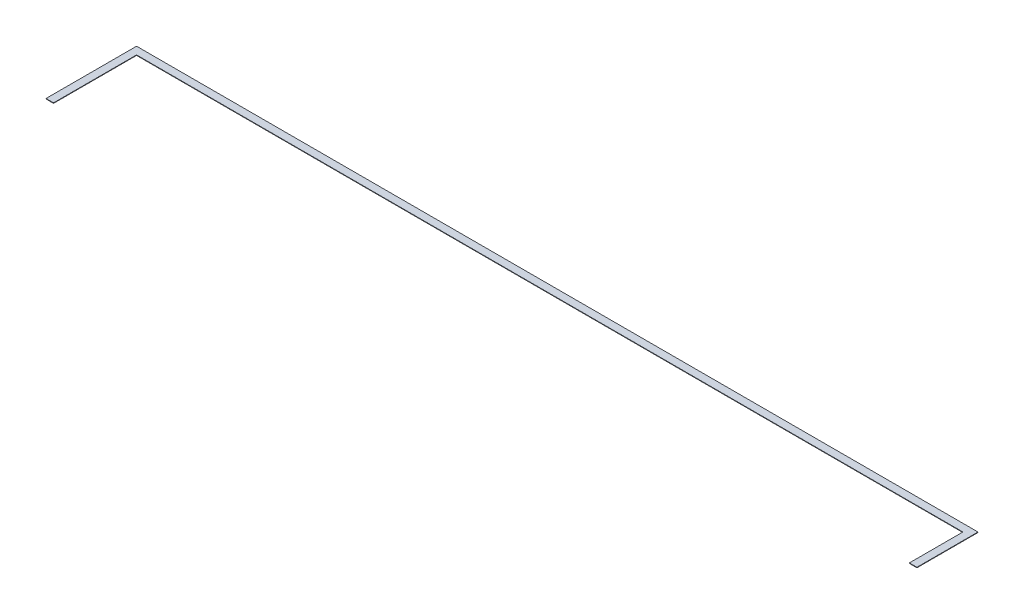
ISO-10303-21;
HEADER;
FILE_DESCRIPTION(('STEP AP214'),'2;1');
FILE_NAME('part.step','',(''),(''),'','','');
FILE_SCHEMA(('AUTOMOTIVE_DESIGN { 1 0 10303 214 1 1 1 1 }'));
ENDSEC;
DATA;
#1=APPLICATION_CONTEXT('core data for automotive mechanical design processes');
#2=APPLICATION_PROTOCOL_DEFINITION('international standard','automotive_design',2000,#1);
#3=PRODUCT_CONTEXT('',#1,'mechanical');
#4=PRODUCT('Part','Part','',(#3));
#5=PRODUCT_RELATED_PRODUCT_CATEGORY('part','',(#4));
#6=PRODUCT_DEFINITION_FORMATION('','',#4);
#7=PRODUCT_DEFINITION_CONTEXT('part definition',#1,'design');
#8=PRODUCT_DEFINITION('design','',#6,#7);
#9=PRODUCT_DEFINITION_SHAPE('','',#8);
#10=(LENGTH_UNIT() NAMED_UNIT(*) SI_UNIT(.MILLI.,.METRE.));
#11=(NAMED_UNIT(*) PLANE_ANGLE_UNIT() SI_UNIT($,.RADIAN.));
#12=(NAMED_UNIT(*) SI_UNIT($,.STERADIAN.) SOLID_ANGLE_UNIT());
#13=UNCERTAINTY_MEASURE_WITH_UNIT(LENGTH_MEASURE(1.E-05),#10,'distance_accuracy_value','');
#14=(GEOMETRIC_REPRESENTATION_CONTEXT(3) GLOBAL_UNCERTAINTY_ASSIGNED_CONTEXT((#13)) GLOBAL_UNIT_ASSIGNED_CONTEXT((#10,
#11,#12)) REPRESENTATION_CONTEXT('',''));
#15=CARTESIAN_POINT('',(0.,0.,0.));
#16=DIRECTION('',(0.,0.,1.));
#17=DIRECTION('',(1.,0.,0.));
#18=AXIS2_PLACEMENT_3D('',#15,#16,#17);
#19=CARTESIAN_POINT('',(0.,3.175,0.));
#20=DIRECTION('',(1.,0.,0.));
#21=DIRECTION('',(0.,0.,-1.));
#22=AXIS2_PLACEMENT_3D('',#19,#20,#21);
#23=PLANE('',#22);
#24=DIRECTION('',(0.,0.,1.));
#25=VECTOR('',#24,1.);
#26=CARTESIAN_POINT('',(0.,0.,0.));
#27=LINE('',#26,#25);
#28=CARTESIAN_POINT('',(0.,0.,-609.6));
#29=VERTEX_POINT('',#28);
#30=CARTESIAN_POINT('',(0.,0.,0.));
#31=VERTEX_POINT('',#30);
#32=EDGE_CURVE('E129',#29,#31,#27,.T.);
#33=ORIENTED_EDGE('',*,*,#32,.T.);
#34=DIRECTION('',(0.,-1.,0.));
#35=VECTOR('',#34,1.);
#36=CARTESIAN_POINT('',(0.,3.175,0.));
#37=LINE('',#36,#35);
#38=CARTESIAN_POINT('',(0.,3.175,0.));
#39=VERTEX_POINT('',#38);
#40=EDGE_CURVE('E11',#39,#31,#37,.T.);
#41=ORIENTED_EDGE('',*,*,#40,.F.);
#42=DIRECTION('',(0.,0.,1.));
#43=VECTOR('',#42,1.);
#44=CARTESIAN_POINT('',(0.,3.175,0.));
#45=LINE('',#44,#43);
#46=CARTESIAN_POINT('',(0.,3.175,-609.6));
#47=VERTEX_POINT('',#46);
#48=EDGE_CURVE('E143',#47,#39,#45,.T.);
#49=ORIENTED_EDGE('',*,*,#48,.F.);
#50=DIRECTION('',(0.,-1.,0.));
#51=VECTOR('',#50,1.);
#52=CARTESIAN_POINT('',(0.,3.175,-609.6));
#53=LINE('',#52,#51);
#54=EDGE_CURVE('E125',#47,#29,#53,.T.);
#55=ORIENTED_EDGE('',*,*,#54,.T.);
#56=EDGE_LOOP('',(#33,#41,#49,#55));
#57=FACE_BOUND('',#56,.T.);
#58=ADVANCED_FACE('F33',(#57),#23,.F.);
#59=CARTESIAN_POINT('',(0.,3.175,0.));
#60=DIRECTION('',(0.,0.,-1.));
#61=DIRECTION('',(-1.,0.,0.));
#62=AXIS2_PLACEMENT_3D('',#59,#60,#61);
#63=PLANE('',#62);
#64=DIRECTION('',(1.,0.,0.));
#65=VECTOR('',#64,1.);
#66=CARTESIAN_POINT('',(0.,0.,0.));
#67=LINE('',#66,#65);
#68=CARTESIAN_POINT('',(50.8,0.,0.));
#69=VERTEX_POINT('',#68);
#70=EDGE_CURVE('E132',#31,#69,#67,.T.);
#71=ORIENTED_EDGE('',*,*,#70,.T.);
#72=DIRECTION('',(0.,-1.,0.));
#73=VECTOR('',#72,1.);
#74=CARTESIAN_POINT('',(50.8,3.175,0.));
#75=LINE('',#74,#73);
#76=CARTESIAN_POINT('',(50.8,3.175,0.));
#77=VERTEX_POINT('',#76);
#78=EDGE_CURVE('E41',#77,#69,#75,.T.);
#79=ORIENTED_EDGE('',*,*,#78,.F.);
#80=DIRECTION('',(1.,0.,0.));
#81=VECTOR('',#80,1.);
#82=CARTESIAN_POINT('',(0.,3.175,0.));
#83=LINE('',#82,#81);
#84=EDGE_CURVE('E92',#39,#77,#83,.T.);
#85=ORIENTED_EDGE('',*,*,#84,.F.);
#86=ORIENTED_EDGE('',*,*,#40,.T.);
#87=EDGE_LOOP('',(#71,#79,#85,#86));
#88=FACE_BOUND('',#87,.T.);
#89=ADVANCED_FACE('F178',(#88),#63,.F.);
#90=CARTESIAN_POINT('',(50.8,3.175,0.));
#91=DIRECTION('',(-1.,0.,0.));
#92=DIRECTION('',(0.,0.,1.));
#93=AXIS2_PLACEMENT_3D('',#90,#91,#92);
#94=PLANE('',#93);
#95=DIRECTION('',(0.,0.,-1.));
#96=VECTOR('',#95,1.);
#97=CARTESIAN_POINT('',(50.8,0.,0.));
#98=LINE('',#97,#96);
#99=CARTESIAN_POINT('',(50.8,0.,-558.8));
#100=VERTEX_POINT('',#99);
#101=EDGE_CURVE('E134',#69,#100,#98,.T.);
#102=ORIENTED_EDGE('',*,*,#101,.T.);
#103=DIRECTION('',(0.,-1.,0.));
#104=VECTOR('',#103,1.);
#105=CARTESIAN_POINT('',(50.8,3.175,-558.8));
#106=LINE('',#105,#104);
#107=CARTESIAN_POINT('',(50.8,3.175,-558.8));
#108=VERTEX_POINT('',#107);
#109=EDGE_CURVE('E150',#108,#100,#106,.T.);
#110=ORIENTED_EDGE('',*,*,#109,.F.);
#111=DIRECTION('',(0.,0.,-1.));
#112=VECTOR('',#111,1.);
#113=CARTESIAN_POINT('',(50.8,3.175,0.));
#114=LINE('',#113,#112);
#115=EDGE_CURVE('E158',#77,#108,#114,.T.);
#116=ORIENTED_EDGE('',*,*,#115,.F.);
#117=ORIENTED_EDGE('',*,*,#78,.T.);
#118=EDGE_LOOP('',(#102,#110,#116,#117));
#119=FACE_BOUND('',#118,.T.);
#120=ADVANCED_FACE('F156',(#119),#94,.F.);
#121=CARTESIAN_POINT('',(5613.4,3.175,-558.800000000001));
#122=DIRECTION('',(0.,0.,-1.));
#123=DIRECTION('',(-1.,0.,0.));
#124=AXIS2_PLACEMENT_3D('',#121,#122,#123);
#125=PLANE('',#124);
#126=DIRECTION('',(1.,0.,0.));
#127=VECTOR('',#126,1.);
#128=CARTESIAN_POINT('',(5613.4,0.,-558.800000000001));
#129=LINE('',#128,#127);
#130=CARTESIAN_POINT('',(5613.4,0.,-558.800000000001));
#131=VERTEX_POINT('',#130);
#132=EDGE_CURVE('E136',#100,#131,#129,.T.);
#133=ORIENTED_EDGE('',*,*,#132,.T.);
#134=DIRECTION('',(0.,-1.,0.));
#135=VECTOR('',#134,1.);
#136=CARTESIAN_POINT('',(5613.4,3.175,-558.800000000001));
#137=LINE('',#136,#135);
#138=CARTESIAN_POINT('',(5613.4,3.175,-558.800000000001));
#139=VERTEX_POINT('',#138);
#140=EDGE_CURVE('E147',#139,#131,#137,.T.);
#141=ORIENTED_EDGE('',*,*,#140,.F.);
#142=DIRECTION('',(1.,0.,0.));
#143=VECTOR('',#142,1.);
#144=CARTESIAN_POINT('',(5613.4,3.175,-558.800000000001));
#145=LINE('',#144,#143);
#146=EDGE_CURVE('E170',#108,#139,#145,.T.);
#147=ORIENTED_EDGE('',*,*,#146,.F.);
#148=ORIENTED_EDGE('',*,*,#109,.T.);
#149=EDGE_LOOP('',(#133,#141,#147,#148));
#150=FACE_BOUND('',#149,.T.);
#151=ADVANCED_FACE('F166',(#150),#125,.F.);
#152=CARTESIAN_POINT('',(5613.4,3.175,-198.4375));
#153=DIRECTION('',(1.,0.,0.));
#154=DIRECTION('',(0.,0.,-1.));
#155=AXIS2_PLACEMENT_3D('',#152,#153,#154);
#156=PLANE('',#155);
#157=DIRECTION('',(0.,0.,1.));
#158=VECTOR('',#157,1.);
#159=CARTESIAN_POINT('',(5613.4,0.,-198.4375));
#160=LINE('',#159,#158);
#161=CARTESIAN_POINT('',(5613.4,0.,-198.4375));
#162=VERTEX_POINT('',#161);
#163=EDGE_CURVE('E138',#131,#162,#160,.T.);
#164=ORIENTED_EDGE('',*,*,#163,.T.);
#165=DIRECTION('',(0.,-1.,0.));
#166=VECTOR('',#165,1.);
#167=CARTESIAN_POINT('',(5613.4,3.175,-198.4375));
#168=LINE('',#167,#166);
#169=CARTESIAN_POINT('',(5613.4,3.175,-198.4375));
#170=VERTEX_POINT('',#169);
#171=EDGE_CURVE('E120',#170,#162,#168,.T.);
#172=ORIENTED_EDGE('',*,*,#171,.F.);
#173=DIRECTION('',(0.,0.,1.));
#174=VECTOR('',#173,1.);
#175=CARTESIAN_POINT('',(5613.4,3.175,-198.4375));
#176=LINE('',#175,#174);
#177=EDGE_CURVE('E111',#139,#170,#176,.T.);
#178=ORIENTED_EDGE('',*,*,#177,.F.);
#179=ORIENTED_EDGE('',*,*,#140,.T.);
#180=EDGE_LOOP('',(#164,#172,#178,#179));
#181=FACE_BOUND('',#180,.T.);
#182=ADVANCED_FACE('F169',(#181),#156,.F.);
#183=CARTESIAN_POINT('',(5664.2,3.175,-198.4375));
#184=DIRECTION('',(0.,0.,-1.));
#185=DIRECTION('',(-1.,0.,0.));
#186=AXIS2_PLACEMENT_3D('',#183,#184,#185);
#187=PLANE('',#186);
#188=DIRECTION('',(1.,0.,0.));
#189=VECTOR('',#188,1.);
#190=CARTESIAN_POINT('',(5664.2,0.,-198.4375));
#191=LINE('',#190,#189);
#192=CARTESIAN_POINT('',(5664.2,0.,-198.4375));
#193=VERTEX_POINT('',#192);
#194=EDGE_CURVE('E119',#162,#193,#191,.T.);
#195=ORIENTED_EDGE('',*,*,#194,.T.);
#196=DIRECTION('',(0.,-1.,0.));
#197=VECTOR('',#196,1.);
#198=CARTESIAN_POINT('',(5664.2,3.175,-198.4375));
#199=LINE('',#198,#197);
#200=CARTESIAN_POINT('',(5664.2,3.175,-198.4375));
#201=VERTEX_POINT('',#200);
#202=EDGE_CURVE('E116',#201,#193,#199,.T.);
#203=ORIENTED_EDGE('',*,*,#202,.F.);
#204=DIRECTION('',(1.,0.,0.));
#205=VECTOR('',#204,1.);
#206=CARTESIAN_POINT('',(5664.2,3.175,-198.4375));
#207=LINE('',#206,#205);
#208=EDGE_CURVE('E105',#170,#201,#207,.T.);
#209=ORIENTED_EDGE('',*,*,#208,.F.);
#210=ORIENTED_EDGE('',*,*,#171,.T.);
#211=EDGE_LOOP('',(#195,#203,#209,#210));
#212=FACE_BOUND('',#211,.T.);
#213=ADVANCED_FACE('F117',(#212),#187,.F.);
#214=CARTESIAN_POINT('',(5664.2,3.175,-609.6));
#215=DIRECTION('',(-1.,0.,0.));
#216=DIRECTION('',(0.,0.,1.));
#217=AXIS2_PLACEMENT_3D('',#214,#215,#216);
#218=PLANE('',#217);
#219=DIRECTION('',(0.,0.,-1.));
#220=VECTOR('',#219,1.);
#221=CARTESIAN_POINT('',(5664.2,0.,-609.6));
#222=LINE('',#221,#220);
#223=CARTESIAN_POINT('',(5664.2,0.,-609.6));
#224=VERTEX_POINT('',#223);
#225=EDGE_CURVE('E78',#193,#224,#222,.T.);
#226=ORIENTED_EDGE('',*,*,#225,.T.);
#227=DIRECTION('',(0.,-1.,0.));
#228=VECTOR('',#227,1.);
#229=CARTESIAN_POINT('',(5664.2,3.175,-609.6));
#230=LINE('',#229,#228);
#231=CARTESIAN_POINT('',(5664.2,3.175,-609.6));
#232=VERTEX_POINT('',#231);
#233=EDGE_CURVE('E121',#232,#224,#230,.T.);
#234=ORIENTED_EDGE('',*,*,#233,.F.);
#235=DIRECTION('',(0.,0.,-1.));
#236=VECTOR('',#235,1.);
#237=CARTESIAN_POINT('',(5664.2,3.175,-609.6));
#238=LINE('',#237,#236);
#239=EDGE_CURVE('E109',#201,#232,#238,.T.);
#240=ORIENTED_EDGE('',*,*,#239,.F.);
#241=ORIENTED_EDGE('',*,*,#202,.T.);
#242=EDGE_LOOP('',(#226,#234,#240,#241));
#243=FACE_BOUND('',#242,.T.);
#244=ADVANCED_FACE('F123',(#243),#218,.F.);
#245=CARTESIAN_POINT('',(0.,3.175,-609.6));
#246=DIRECTION('',(0.,0.,1.));
#247=DIRECTION('',(1.,0.,0.));
#248=AXIS2_PLACEMENT_3D('',#245,#246,#247);
#249=PLANE('',#248);
#250=DIRECTION('',(-1.,0.,0.));
#251=VECTOR('',#250,1.);
#252=CARTESIAN_POINT('',(0.,0.,-609.6));
#253=LINE('',#252,#251);
#254=EDGE_CURVE('E84',#224,#29,#253,.T.);
#255=ORIENTED_EDGE('',*,*,#254,.T.);
#256=ORIENTED_EDGE('',*,*,#54,.F.);
#257=DIRECTION('',(-1.,0.,0.));
#258=VECTOR('',#257,1.);
#259=CARTESIAN_POINT('',(0.,3.175,-609.6));
#260=LINE('',#259,#258);
#261=EDGE_CURVE('E49',#232,#47,#260,.T.);
#262=ORIENTED_EDGE('',*,*,#261,.F.);
#263=ORIENTED_EDGE('',*,*,#233,.T.);
#264=EDGE_LOOP('',(#255,#256,#262,#263));
#265=FACE_BOUND('',#264,.T.);
#266=ADVANCED_FACE('F194',(#265),#249,.F.);
#267=CARTESIAN_POINT('',(0.,3.175,0.));
#268=DIRECTION('',(0.,-1.,0.));
#269=DIRECTION('',(0.,0.,-1.));
#270=AXIS2_PLACEMENT_3D('',#267,#268,#269);
#271=PLANE('',#270);
#272=ORIENTED_EDGE('',*,*,#48,.T.);
#273=ORIENTED_EDGE('',*,*,#84,.T.);
#274=ORIENTED_EDGE('',*,*,#115,.T.);
#275=ORIENTED_EDGE('',*,*,#146,.T.);
#276=ORIENTED_EDGE('',*,*,#177,.T.);
#277=ORIENTED_EDGE('',*,*,#208,.T.);
#278=ORIENTED_EDGE('',*,*,#239,.T.);
#279=ORIENTED_EDGE('',*,*,#261,.T.);
#280=EDGE_LOOP('',(#272,#273,#274,#275,#276,#277,#278,#279));
#281=FACE_BOUND('',#280,.T.);
#282=ADVANCED_FACE('F107',(#281),#271,.F.);
#283=CARTESIAN_POINT('',(0.,0.,0.));
#284=DIRECTION('',(0.,-1.,0.));
#285=DIRECTION('',(0.,0.,-1.));
#286=AXIS2_PLACEMENT_3D('',#283,#284,#285);
#287=PLANE('',#286);
#288=ORIENTED_EDGE('',*,*,#32,.F.);
#289=ORIENTED_EDGE('',*,*,#254,.F.);
#290=ORIENTED_EDGE('',*,*,#225,.F.);
#291=ORIENTED_EDGE('',*,*,#194,.F.);
#292=ORIENTED_EDGE('',*,*,#163,.F.);
#293=ORIENTED_EDGE('',*,*,#132,.F.);
#294=ORIENTED_EDGE('',*,*,#101,.F.);
#295=ORIENTED_EDGE('',*,*,#70,.F.);
#296=EDGE_LOOP('',(#288,#289,#290,#291,#292,#293,#294,#295));
#297=FACE_BOUND('',#296,.T.);
#298=ADVANCED_FACE('F162',(#297),#287,.T.);
#299=CLOSED_SHELL('',(#58,#89,#120,#151,#182,#213,#244,#266,#282,#298));
#300=MANIFOLD_SOLID_BREP('B2',#299);
#301=ADVANCED_BREP_SHAPE_REPRESENTATION('',(#18,#300),#14);
#302=SHAPE_DEFINITION_REPRESENTATION(#9,#301);
ENDSEC;
END-ISO-10303-21;
